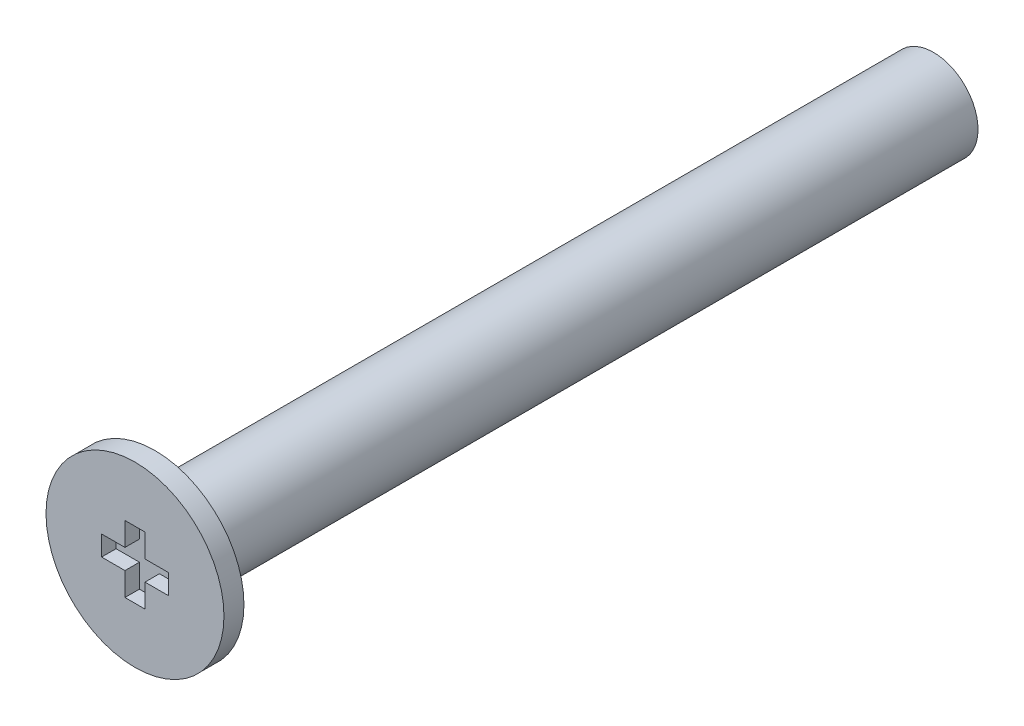
ISO-10303-21;
HEADER;
FILE_DESCRIPTION(('STEP AP214'),'2;1');
FILE_NAME('part.step','',(''),(''),'','','');
FILE_SCHEMA(('AUTOMOTIVE_DESIGN { 1 0 10303 214 1 1 1 1 }'));
ENDSEC;
DATA;
#1=APPLICATION_CONTEXT('core data for automotive mechanical design processes');
#2=APPLICATION_PROTOCOL_DEFINITION('international standard','automotive_design',2000,#1);
#3=PRODUCT_CONTEXT('',#1,'mechanical');
#4=PRODUCT('Part','Part','',(#3));
#5=PRODUCT_RELATED_PRODUCT_CATEGORY('part','',(#4));
#6=PRODUCT_DEFINITION_FORMATION('','',#4);
#7=PRODUCT_DEFINITION_CONTEXT('part definition',#1,'design');
#8=PRODUCT_DEFINITION('design','',#6,#7);
#9=PRODUCT_DEFINITION_SHAPE('','',#8);
#10=(LENGTH_UNIT() NAMED_UNIT(*) SI_UNIT(.MILLI.,.METRE.));
#11=(NAMED_UNIT(*) PLANE_ANGLE_UNIT() SI_UNIT($,.RADIAN.));
#12=(NAMED_UNIT(*) SI_UNIT($,.STERADIAN.) SOLID_ANGLE_UNIT());
#13=UNCERTAINTY_MEASURE_WITH_UNIT(LENGTH_MEASURE(1.E-05),#10,'distance_accuracy_value','');
#14=(GEOMETRIC_REPRESENTATION_CONTEXT(3) GLOBAL_UNCERTAINTY_ASSIGNED_CONTEXT((#13)) GLOBAL_UNIT_ASSIGNED_CONTEXT((#10,
#11,#12)) REPRESENTATION_CONTEXT('',''));
#15=CARTESIAN_POINT('',(0.,0.,0.));
#16=DIRECTION('',(0.,0.,1.));
#17=DIRECTION('',(1.,0.,0.));
#18=AXIS2_PLACEMENT_3D('',#15,#16,#17);
#19=CARTESIAN_POINT('',(0.,0.,-35.));
#20=DIRECTION('',(0.,0.,1.));
#21=DIRECTION('',(1.,0.,0.));
#22=AXIS2_PLACEMENT_3D('',#19,#20,#21);
#23=CYLINDRICAL_SURFACE('',#22,2.);
#24=CARTESIAN_POINT('',(0.,0.,-35.));
#25=DIRECTION('',(0.,0.,1.));
#26=DIRECTION('',(1.,0.,0.));
#27=AXIS2_PLACEMENT_3D('',#24,#25,#26);
#28=CIRCLE('',#27,2.);
#29=CARTESIAN_POINT('',(2.,0.,-35.));
#30=VERTEX_POINT('',#29);
#31=EDGE_CURVE('E245',#30,#30,#28,.T.);
#32=ORIENTED_EDGE('',*,*,#31,.T.);
#33=EDGE_LOOP('',(#32));
#34=FACE_BOUND('',#33,.T.);
#35=CARTESIAN_POINT('',(0.,0.,0.));
#36=DIRECTION('',(0.,0.,1.));
#37=DIRECTION('',(1.,0.,0.));
#38=AXIS2_PLACEMENT_3D('',#35,#36,#37);
#39=CIRCLE('',#38,2.);
#40=CARTESIAN_POINT('',(2.,0.,0.));
#41=VERTEX_POINT('',#40);
#42=EDGE_CURVE('E241',#41,#41,#39,.T.);
#43=ORIENTED_EDGE('',*,*,#42,.F.);
#44=EDGE_LOOP('',(#43));
#45=FACE_BOUND('',#44,.T.);
#46=ADVANCED_FACE('F44',(#34,#45),#23,.T.);
#47=CARTESIAN_POINT('',(0.,0.,-35.));
#48=DIRECTION('',(0.,0.,1.));
#49=DIRECTION('',(1.,0.,0.));
#50=AXIS2_PLACEMENT_3D('',#47,#48,#49);
#51=PLANE('',#50);
#52=ORIENTED_EDGE('',*,*,#31,.F.);
#53=EDGE_LOOP('',(#52));
#54=FACE_BOUND('',#53,.T.);
#55=ADVANCED_FACE('F329',(#54),#51,.F.);
#56=CARTESIAN_POINT('',(0.,0.,0.));
#57=DIRECTION('',(0.,0.,1.));
#58=DIRECTION('',(1.,0.,0.));
#59=AXIS2_PLACEMENT_3D('',#56,#57,#58);
#60=PLANE('',#59);
#61=ORIENTED_EDGE('',*,*,#42,.T.);
#62=EDGE_LOOP('',(#61));
#63=FACE_BOUND('',#62,.T.);
#64=CARTESIAN_POINT('',(0.,0.,0.));
#65=DIRECTION('',(0.,0.,-1.));
#66=DIRECTION('',(-1.,0.,0.));
#67=AXIS2_PLACEMENT_3D('',#64,#65,#66);
#68=CIRCLE('',#67,4.);
#69=CARTESIAN_POINT('',(-4.,0.,0.));
#70=VERTEX_POINT('',#69);
#71=EDGE_CURVE('E240',#70,#70,#68,.T.);
#72=ORIENTED_EDGE('',*,*,#71,.T.);
#73=EDGE_LOOP('',(#72));
#74=FACE_BOUND('',#73,.T.);
#75=ADVANCED_FACE('F331',(#63,#74),#60,.F.);
#76=CARTESIAN_POINT('',(0.,0.,-2.));
#77=DIRECTION('',(0.,0.,-1.));
#78=DIRECTION('',(-1.,0.,0.));
#79=AXIS2_PLACEMENT_3D('',#76,#77,#78);
#80=CYLINDRICAL_SURFACE('',#79,4.);
#81=ORIENTED_EDGE('',*,*,#71,.F.);
#82=EDGE_LOOP('',(#81));
#83=FACE_BOUND('',#82,.T.);
#84=CARTESIAN_POINT('',(0.,0.,0.9));
#85=DIRECTION('',(0.,0.,-1.));
#86=DIRECTION('',(-1.,0.,0.));
#87=AXIS2_PLACEMENT_3D('',#84,#85,#86);
#88=CIRCLE('',#87,4.);
#89=CARTESIAN_POINT('',(-4.,0.,0.9));
#90=VERTEX_POINT('',#89);
#91=EDGE_CURVE('E196',#90,#90,#88,.T.);
#92=ORIENTED_EDGE('',*,*,#91,.T.);
#93=EDGE_LOOP('',(#92));
#94=FACE_BOUND('',#93,.T.);
#95=ADVANCED_FACE('F341',(#83,#94),#80,.T.);
#96=CARTESIAN_POINT('',(4.,0.,0.9));
#97=DIRECTION('',(0.,0.,-1.));
#98=DIRECTION('',(-1.,0.,0.));
#99=AXIS2_PLACEMENT_3D('',#96,#97,#98);
#100=PLANE('',#99);
#101=DIRECTION('',(-1.,0.,0.));
#102=VECTOR('',#101,1.);
#103=CARTESIAN_POINT('',(4.,-1.5,0.9));
#104=LINE('',#103,#102);
#105=CARTESIAN_POINT('',(0.45,-1.5,0.9));
#106=VERTEX_POINT('',#105);
#107=CARTESIAN_POINT('',(-0.45,-1.5,0.9));
#108=VERTEX_POINT('',#107);
#109=EDGE_CURVE('E246',#106,#108,#104,.T.);
#110=ORIENTED_EDGE('',*,*,#109,.T.);
#111=DIRECTION('',(0.,1.,0.));
#112=VECTOR('',#111,1.);
#113=CARTESIAN_POINT('',(-0.45,0.,0.9));
#114=LINE('',#113,#112);
#115=CARTESIAN_POINT('',(-0.45,-0.45,0.9));
#116=VERTEX_POINT('',#115);
#117=EDGE_CURVE('E11',#108,#116,#114,.T.);
#118=ORIENTED_EDGE('',*,*,#117,.T.);
#119=DIRECTION('',(-1.,0.,0.));
#120=VECTOR('',#119,1.);
#121=CARTESIAN_POINT('',(4.,-0.45,0.9));
#122=LINE('',#121,#120);
#123=CARTESIAN_POINT('',(-1.5,-0.45,0.9));
#124=VERTEX_POINT('',#123);
#125=EDGE_CURVE('E52',#116,#124,#122,.T.);
#126=ORIENTED_EDGE('',*,*,#125,.T.);
#127=DIRECTION('',(0.,1.,0.));
#128=VECTOR('',#127,1.);
#129=CARTESIAN_POINT('',(-1.5,0.,0.9));
#130=LINE('',#129,#128);
#131=CARTESIAN_POINT('',(-1.5,0.45,0.9));
#132=VERTEX_POINT('',#131);
#133=EDGE_CURVE('E281',#124,#132,#130,.T.);
#134=ORIENTED_EDGE('',*,*,#133,.T.);
#135=DIRECTION('',(1.,0.,0.));
#136=VECTOR('',#135,1.);
#137=CARTESIAN_POINT('',(4.,0.45,0.9));
#138=LINE('',#137,#136);
#139=CARTESIAN_POINT('',(-0.45,0.45,0.9));
#140=VERTEX_POINT('',#139);
#141=EDGE_CURVE('E279',#132,#140,#138,.T.);
#142=ORIENTED_EDGE('',*,*,#141,.T.);
#143=DIRECTION('',(0.,1.,0.));
#144=VECTOR('',#143,1.);
#145=CARTESIAN_POINT('',(-0.45,0.,0.9));
#146=LINE('',#145,#144);
#147=CARTESIAN_POINT('',(-0.45,1.5,0.9));
#148=VERTEX_POINT('',#147);
#149=EDGE_CURVE('E276',#140,#148,#146,.T.);
#150=ORIENTED_EDGE('',*,*,#149,.T.);
#151=DIRECTION('',(1.,0.,0.));
#152=VECTOR('',#151,1.);
#153=CARTESIAN_POINT('',(4.,1.5,0.9));
#154=LINE('',#153,#152);
#155=CARTESIAN_POINT('',(0.45,1.5,0.9));
#156=VERTEX_POINT('',#155);
#157=EDGE_CURVE('E275',#148,#156,#154,.T.);
#158=ORIENTED_EDGE('',*,*,#157,.T.);
#159=DIRECTION('',(0.,-1.,0.));
#160=VECTOR('',#159,1.);
#161=CARTESIAN_POINT('',(0.45,0.,0.9));
#162=LINE('',#161,#160);
#163=CARTESIAN_POINT('',(0.45,0.45,0.9));
#164=VERTEX_POINT('',#163);
#165=EDGE_CURVE('E268',#156,#164,#162,.T.);
#166=ORIENTED_EDGE('',*,*,#165,.T.);
#167=DIRECTION('',(1.,0.,0.));
#168=VECTOR('',#167,1.);
#169=CARTESIAN_POINT('',(4.,0.45,0.9));
#170=LINE('',#169,#168);
#171=CARTESIAN_POINT('',(1.5,0.45,0.9));
#172=VERTEX_POINT('',#171);
#173=EDGE_CURVE('E264',#164,#172,#170,.T.);
#174=ORIENTED_EDGE('',*,*,#173,.T.);
#175=DIRECTION('',(0.,-1.,0.));
#176=VECTOR('',#175,1.);
#177=CARTESIAN_POINT('',(1.5,0.,0.9));
#178=LINE('',#177,#176);
#179=CARTESIAN_POINT('',(1.5,-0.45,0.9));
#180=VERTEX_POINT('',#179);
#181=EDGE_CURVE('E259',#172,#180,#178,.T.);
#182=ORIENTED_EDGE('',*,*,#181,.T.);
#183=DIRECTION('',(-1.,0.,0.));
#184=VECTOR('',#183,1.);
#185=CARTESIAN_POINT('',(4.,-0.45,0.9));
#186=LINE('',#185,#184);
#187=CARTESIAN_POINT('',(0.45,-0.45,0.9));
#188=VERTEX_POINT('',#187);
#189=EDGE_CURVE('E258',#180,#188,#186,.T.);
#190=ORIENTED_EDGE('',*,*,#189,.T.);
#191=DIRECTION('',(0.,-1.,0.));
#192=VECTOR('',#191,1.);
#193=CARTESIAN_POINT('',(0.45,0.,0.9));
#194=LINE('',#193,#192);
#195=EDGE_CURVE('E252',#188,#106,#194,.T.);
#196=ORIENTED_EDGE('',*,*,#195,.T.);
#197=EDGE_LOOP('',(#110,#118,#126,#134,#142,#150,#158,#166,#174,#182,#190,#196));
#198=FACE_BOUND('',#197,.T.);
#199=ORIENTED_EDGE('',*,*,#91,.F.);
#200=EDGE_LOOP('',(#199));
#201=FACE_BOUND('',#200,.T.);
#202=ADVANCED_FACE('F286',(#198,#201),#100,.F.);
#203=CARTESIAN_POINT('',(-0.45,-0.45,0.25));
#204=DIRECTION('',(-1.,0.,0.));
#205=DIRECTION('',(0.,0.,1.));
#206=AXIS2_PLACEMENT_3D('',#203,#204,#205);
#207=PLANE('',#206);
#208=DIRECTION('',(0.,0.,1.));
#209=VECTOR('',#208,1.);
#210=CARTESIAN_POINT('',(-0.45,-1.5,0.25));
#211=LINE('',#210,#209);
#212=CARTESIAN_POINT('',(-0.45,-1.5,0.25));
#213=VERTEX_POINT('',#212);
#214=EDGE_CURVE('E58',#213,#108,#211,.T.);
#215=ORIENTED_EDGE('',*,*,#214,.F.);
#216=DIRECTION('',(0.,-1.,0.));
#217=VECTOR('',#216,1.);
#218=CARTESIAN_POINT('',(-0.45,-0.45,0.25));
#219=LINE('',#218,#217);
#220=CARTESIAN_POINT('',(-0.45,-0.45,0.25));
#221=VERTEX_POINT('',#220);
#222=EDGE_CURVE('E133',#221,#213,#219,.T.);
#223=ORIENTED_EDGE('',*,*,#222,.F.);
#224=DIRECTION('',(0.,0.,1.));
#225=VECTOR('',#224,1.);
#226=CARTESIAN_POINT('',(-0.45,-0.45,0.25));
#227=LINE('',#226,#225);
#228=EDGE_CURVE('E193',#221,#116,#227,.T.);
#229=ORIENTED_EDGE('',*,*,#228,.T.);
#230=ORIENTED_EDGE('',*,*,#117,.F.);
#231=EDGE_LOOP('',(#215,#223,#229,#230));
#232=FACE_BOUND('',#231,.T.);
#233=ADVANCED_FACE('F134',(#232),#207,.F.);
#234=CARTESIAN_POINT('',(-1.5,-0.45,0.25));
#235=DIRECTION('',(0.,-1.,0.));
#236=DIRECTION('',(0.,0.,-1.));
#237=AXIS2_PLACEMENT_3D('',#234,#235,#236);
#238=PLANE('',#237);
#239=ORIENTED_EDGE('',*,*,#228,.F.);
#240=DIRECTION('',(1.,0.,0.));
#241=VECTOR('',#240,1.);
#242=CARTESIAN_POINT('',(-1.5,-0.45,0.25));
#243=LINE('',#242,#241);
#244=CARTESIAN_POINT('',(-1.5,-0.45,0.25));
#245=VERTEX_POINT('',#244);
#246=EDGE_CURVE('E138',#245,#221,#243,.T.);
#247=ORIENTED_EDGE('',*,*,#246,.F.);
#248=DIRECTION('',(0.,0.,1.));
#249=VECTOR('',#248,1.);
#250=CARTESIAN_POINT('',(-1.5,-0.45,0.25));
#251=LINE('',#250,#249);
#252=EDGE_CURVE('E200',#245,#124,#251,.T.);
#253=ORIENTED_EDGE('',*,*,#252,.T.);
#254=ORIENTED_EDGE('',*,*,#125,.F.);
#255=EDGE_LOOP('',(#239,#247,#253,#254));
#256=FACE_BOUND('',#255,.T.);
#257=ADVANCED_FACE('F320',(#256),#238,.F.);
#258=CARTESIAN_POINT('',(-1.5,0.45,0.25));
#259=DIRECTION('',(-1.,0.,0.));
#260=DIRECTION('',(0.,0.,1.));
#261=AXIS2_PLACEMENT_3D('',#258,#259,#260);
#262=PLANE('',#261);
#263=ORIENTED_EDGE('',*,*,#252,.F.);
#264=DIRECTION('',(0.,-1.,0.));
#265=VECTOR('',#264,1.);
#266=CARTESIAN_POINT('',(-1.5,0.45,0.25));
#267=LINE('',#266,#265);
#268=CARTESIAN_POINT('',(-1.5,0.45,0.25));
#269=VERTEX_POINT('',#268);
#270=EDGE_CURVE('E186',#269,#245,#267,.T.);
#271=ORIENTED_EDGE('',*,*,#270,.F.);
#272=DIRECTION('',(0.,0.,1.));
#273=VECTOR('',#272,1.);
#274=CARTESIAN_POINT('',(-1.5,0.45,0.25));
#275=LINE('',#274,#273);
#276=EDGE_CURVE('E199',#269,#132,#275,.T.);
#277=ORIENTED_EDGE('',*,*,#276,.T.);
#278=ORIENTED_EDGE('',*,*,#133,.F.);
#279=EDGE_LOOP('',(#263,#271,#277,#278));
#280=FACE_BOUND('',#279,.T.);
#281=ADVANCED_FACE('F316',(#280),#262,.F.);
#282=CARTESIAN_POINT('',(-0.45,0.45,0.25));
#283=DIRECTION('',(0.,1.,0.));
#284=DIRECTION('',(0.,0.,1.));
#285=AXIS2_PLACEMENT_3D('',#282,#283,#284);
#286=PLANE('',#285);
#287=ORIENTED_EDGE('',*,*,#276,.F.);
#288=DIRECTION('',(-1.,0.,0.));
#289=VECTOR('',#288,1.);
#290=CARTESIAN_POINT('',(-0.45,0.45,0.25));
#291=LINE('',#290,#289);
#292=CARTESIAN_POINT('',(-0.45,0.45,0.25));
#293=VERTEX_POINT('',#292);
#294=EDGE_CURVE('E185',#293,#269,#291,.T.);
#295=ORIENTED_EDGE('',*,*,#294,.F.);
#296=DIRECTION('',(0.,0.,1.));
#297=VECTOR('',#296,1.);
#298=CARTESIAN_POINT('',(-0.45,0.45,0.25));
#299=LINE('',#298,#297);
#300=EDGE_CURVE('E203',#293,#140,#299,.T.);
#301=ORIENTED_EDGE('',*,*,#300,.T.);
#302=ORIENTED_EDGE('',*,*,#141,.F.);
#303=EDGE_LOOP('',(#287,#295,#301,#302));
#304=FACE_BOUND('',#303,.T.);
#305=ADVANCED_FACE('F311',(#304),#286,.F.);
#306=CARTESIAN_POINT('',(-0.45,1.5,0.25));
#307=DIRECTION('',(-1.,0.,0.));
#308=DIRECTION('',(0.,0.,1.));
#309=AXIS2_PLACEMENT_3D('',#306,#307,#308);
#310=PLANE('',#309);
#311=ORIENTED_EDGE('',*,*,#300,.F.);
#312=DIRECTION('',(0.,-1.,0.));
#313=VECTOR('',#312,1.);
#314=CARTESIAN_POINT('',(-0.45,1.5,0.25));
#315=LINE('',#314,#313);
#316=CARTESIAN_POINT('',(-0.45,1.5,0.25));
#317=VERTEX_POINT('',#316);
#318=EDGE_CURVE('E180',#317,#293,#315,.T.);
#319=ORIENTED_EDGE('',*,*,#318,.F.);
#320=DIRECTION('',(0.,0.,1.));
#321=VECTOR('',#320,1.);
#322=CARTESIAN_POINT('',(-0.45,1.5,0.25));
#323=LINE('',#322,#321);
#324=EDGE_CURVE('E209',#317,#148,#323,.T.);
#325=ORIENTED_EDGE('',*,*,#324,.T.);
#326=ORIENTED_EDGE('',*,*,#149,.F.);
#327=EDGE_LOOP('',(#311,#319,#325,#326));
#328=FACE_BOUND('',#327,.T.);
#329=ADVANCED_FACE('F308',(#328),#310,.F.);
#330=CARTESIAN_POINT('',(0.45,1.5,0.25));
#331=DIRECTION('',(0.,1.,0.));
#332=DIRECTION('',(0.,0.,1.));
#333=AXIS2_PLACEMENT_3D('',#330,#331,#332);
#334=PLANE('',#333);
#335=ORIENTED_EDGE('',*,*,#324,.F.);
#336=DIRECTION('',(-1.,0.,0.));
#337=VECTOR('',#336,1.);
#338=CARTESIAN_POINT('',(0.45,1.5,0.25));
#339=LINE('',#338,#337);
#340=CARTESIAN_POINT('',(0.45,1.5,0.25));
#341=VERTEX_POINT('',#340);
#342=EDGE_CURVE('E176',#341,#317,#339,.T.);
#343=ORIENTED_EDGE('',*,*,#342,.F.);
#344=DIRECTION('',(0.,0.,1.));
#345=VECTOR('',#344,1.);
#346=CARTESIAN_POINT('',(0.45,1.5,0.25));
#347=LINE('',#346,#345);
#348=EDGE_CURVE('E215',#341,#156,#347,.T.);
#349=ORIENTED_EDGE('',*,*,#348,.T.);
#350=ORIENTED_EDGE('',*,*,#157,.F.);
#351=EDGE_LOOP('',(#335,#343,#349,#350));
#352=FACE_BOUND('',#351,.T.);
#353=ADVANCED_FACE('F310',(#352),#334,.F.);
#354=CARTESIAN_POINT('',(0.45,0.45,0.25));
#355=DIRECTION('',(1.,0.,0.));
#356=DIRECTION('',(0.,0.,-1.));
#357=AXIS2_PLACEMENT_3D('',#354,#355,#356);
#358=PLANE('',#357);
#359=ORIENTED_EDGE('',*,*,#348,.F.);
#360=DIRECTION('',(0.,1.,0.));
#361=VECTOR('',#360,1.);
#362=CARTESIAN_POINT('',(0.45,0.45,0.25));
#363=LINE('',#362,#361);
#364=CARTESIAN_POINT('',(0.45,0.45,0.25));
#365=VERTEX_POINT('',#364);
#366=EDGE_CURVE('E175',#365,#341,#363,.T.);
#367=ORIENTED_EDGE('',*,*,#366,.F.);
#368=DIRECTION('',(0.,0.,1.));
#369=VECTOR('',#368,1.);
#370=CARTESIAN_POINT('',(0.45,0.45,0.25));
#371=LINE('',#370,#369);
#372=EDGE_CURVE('E216',#365,#164,#371,.T.);
#373=ORIENTED_EDGE('',*,*,#372,.T.);
#374=ORIENTED_EDGE('',*,*,#165,.F.);
#375=EDGE_LOOP('',(#359,#367,#373,#374));
#376=FACE_BOUND('',#375,.T.);
#377=ADVANCED_FACE('F305',(#376),#358,.F.);
#378=CARTESIAN_POINT('',(1.5,0.45,0.25));
#379=DIRECTION('',(0.,1.,0.));
#380=DIRECTION('',(0.,0.,1.));
#381=AXIS2_PLACEMENT_3D('',#378,#379,#380);
#382=PLANE('',#381);
#383=ORIENTED_EDGE('',*,*,#372,.F.);
#384=DIRECTION('',(-1.,0.,0.));
#385=VECTOR('',#384,1.);
#386=CARTESIAN_POINT('',(1.5,0.45,0.25));
#387=LINE('',#386,#385);
#388=CARTESIAN_POINT('',(1.5,0.45,0.25));
#389=VERTEX_POINT('',#388);
#390=EDGE_CURVE('E167',#389,#365,#387,.T.);
#391=ORIENTED_EDGE('',*,*,#390,.F.);
#392=DIRECTION('',(0.,0.,1.));
#393=VECTOR('',#392,1.);
#394=CARTESIAN_POINT('',(1.5,0.45,0.25));
#395=LINE('',#394,#393);
#396=EDGE_CURVE('E219',#389,#172,#395,.T.);
#397=ORIENTED_EDGE('',*,*,#396,.T.);
#398=ORIENTED_EDGE('',*,*,#173,.F.);
#399=EDGE_LOOP('',(#383,#391,#397,#398));
#400=FACE_BOUND('',#399,.T.);
#401=ADVANCED_FACE('F301',(#400),#382,.F.);
#402=CARTESIAN_POINT('',(1.5,-0.45,0.25));
#403=DIRECTION('',(1.,0.,0.));
#404=DIRECTION('',(0.,0.,-1.));
#405=AXIS2_PLACEMENT_3D('',#402,#403,#404);
#406=PLANE('',#405);
#407=ORIENTED_EDGE('',*,*,#396,.F.);
#408=DIRECTION('',(0.,1.,0.));
#409=VECTOR('',#408,1.);
#410=CARTESIAN_POINT('',(1.5,-0.45,0.25));
#411=LINE('',#410,#409);
#412=CARTESIAN_POINT('',(1.5,-0.45,0.25));
#413=VERTEX_POINT('',#412);
#414=EDGE_CURVE('E161',#413,#389,#411,.T.);
#415=ORIENTED_EDGE('',*,*,#414,.F.);
#416=DIRECTION('',(0.,0.,1.));
#417=VECTOR('',#416,1.);
#418=CARTESIAN_POINT('',(1.5,-0.45,0.25));
#419=LINE('',#418,#417);
#420=EDGE_CURVE('E222',#413,#180,#419,.T.);
#421=ORIENTED_EDGE('',*,*,#420,.T.);
#422=ORIENTED_EDGE('',*,*,#181,.F.);
#423=EDGE_LOOP('',(#407,#415,#421,#422));
#424=FACE_BOUND('',#423,.T.);
#425=ADVANCED_FACE('F298',(#424),#406,.F.);
#426=CARTESIAN_POINT('',(0.45,-0.45,0.25));
#427=DIRECTION('',(0.,-1.,0.));
#428=DIRECTION('',(0.,0.,-1.));
#429=AXIS2_PLACEMENT_3D('',#426,#427,#428);
#430=PLANE('',#429);
#431=ORIENTED_EDGE('',*,*,#420,.F.);
#432=DIRECTION('',(1.,0.,0.));
#433=VECTOR('',#432,1.);
#434=CARTESIAN_POINT('',(0.45,-0.45,0.25));
#435=LINE('',#434,#433);
#436=CARTESIAN_POINT('',(0.45,-0.45,0.25));
#437=VERTEX_POINT('',#436);
#438=EDGE_CURVE('E158',#437,#413,#435,.T.);
#439=ORIENTED_EDGE('',*,*,#438,.F.);
#440=DIRECTION('',(0.,0.,1.));
#441=VECTOR('',#440,1.);
#442=CARTESIAN_POINT('',(0.45,-0.45,0.25));
#443=LINE('',#442,#441);
#444=EDGE_CURVE('E229',#437,#188,#443,.T.);
#445=ORIENTED_EDGE('',*,*,#444,.T.);
#446=ORIENTED_EDGE('',*,*,#189,.F.);
#447=EDGE_LOOP('',(#431,#439,#445,#446));
#448=FACE_BOUND('',#447,.T.);
#449=ADVANCED_FACE('F296',(#448),#430,.F.);
#450=CARTESIAN_POINT('',(0.45,-1.5,0.25));
#451=DIRECTION('',(1.,0.,0.));
#452=DIRECTION('',(0.,0.,-1.));
#453=AXIS2_PLACEMENT_3D('',#450,#451,#452);
#454=PLANE('',#453);
#455=ORIENTED_EDGE('',*,*,#444,.F.);
#456=DIRECTION('',(0.,1.,0.));
#457=VECTOR('',#456,1.);
#458=CARTESIAN_POINT('',(0.45,-1.5,0.25));
#459=LINE('',#458,#457);
#460=CARTESIAN_POINT('',(0.45,-1.5,0.25));
#461=VERTEX_POINT('',#460);
#462=EDGE_CURVE('E149',#461,#437,#459,.T.);
#463=ORIENTED_EDGE('',*,*,#462,.F.);
#464=DIRECTION('',(0.,0.,1.));
#465=VECTOR('',#464,1.);
#466=CARTESIAN_POINT('',(0.45,-1.5,0.25));
#467=LINE('',#466,#465);
#468=EDGE_CURVE('E136',#461,#106,#467,.T.);
#469=ORIENTED_EDGE('',*,*,#468,.T.);
#470=ORIENTED_EDGE('',*,*,#195,.F.);
#471=EDGE_LOOP('',(#455,#463,#469,#470));
#472=FACE_BOUND('',#471,.T.);
#473=ADVANCED_FACE('F295',(#472),#454,.F.);
#474=CARTESIAN_POINT('',(-0.45,-1.5,0.25));
#475=DIRECTION('',(0.,-1.,0.));
#476=DIRECTION('',(0.,0.,-1.));
#477=AXIS2_PLACEMENT_3D('',#474,#475,#476);
#478=PLANE('',#477);
#479=ORIENTED_EDGE('',*,*,#468,.F.);
#480=DIRECTION('',(1.,0.,0.));
#481=VECTOR('',#480,1.);
#482=CARTESIAN_POINT('',(-0.45,-1.5,0.25));
#483=LINE('',#482,#481);
#484=EDGE_CURVE('E142',#213,#461,#483,.T.);
#485=ORIENTED_EDGE('',*,*,#484,.F.);
#486=ORIENTED_EDGE('',*,*,#214,.T.);
#487=ORIENTED_EDGE('',*,*,#109,.F.);
#488=EDGE_LOOP('',(#479,#485,#486,#487));
#489=FACE_BOUND('',#488,.T.);
#490=ADVANCED_FACE('F143',(#489),#478,.F.);
#491=CARTESIAN_POINT('',(0.,0.,0.25));
#492=DIRECTION('',(0.,0.,1.));
#493=DIRECTION('',(1.,0.,0.));
#494=AXIS2_PLACEMENT_3D('',#491,#492,#493);
#495=PLANE('',#494);
#496=ORIENTED_EDGE('',*,*,#222,.T.);
#497=ORIENTED_EDGE('',*,*,#484,.T.);
#498=ORIENTED_EDGE('',*,*,#462,.T.);
#499=ORIENTED_EDGE('',*,*,#438,.T.);
#500=ORIENTED_EDGE('',*,*,#414,.T.);
#501=ORIENTED_EDGE('',*,*,#390,.T.);
#502=ORIENTED_EDGE('',*,*,#366,.T.);
#503=ORIENTED_EDGE('',*,*,#342,.T.);
#504=ORIENTED_EDGE('',*,*,#318,.T.);
#505=ORIENTED_EDGE('',*,*,#294,.T.);
#506=ORIENTED_EDGE('',*,*,#270,.T.);
#507=ORIENTED_EDGE('',*,*,#246,.T.);
#508=EDGE_LOOP('',(#496,#497,#498,#499,#500,#501,#502,#503,#504,#505,#506,#507));
#509=FACE_BOUND('',#508,.T.);
#510=ADVANCED_FACE('F152',(#509),#495,.T.);
#511=CLOSED_SHELL('',(#46,#55,#75,#95,#202,#233,#257,#281,#305,#329,#353,#377,#401,#425,#449,
#473,#490,#510));
#512=MANIFOLD_SOLID_BREP('B2',#511);
#513=ADVANCED_BREP_SHAPE_REPRESENTATION('',(#18,#512),#14);
#514=SHAPE_DEFINITION_REPRESENTATION(#9,#513);
ENDSEC;
END-ISO-10303-21;
